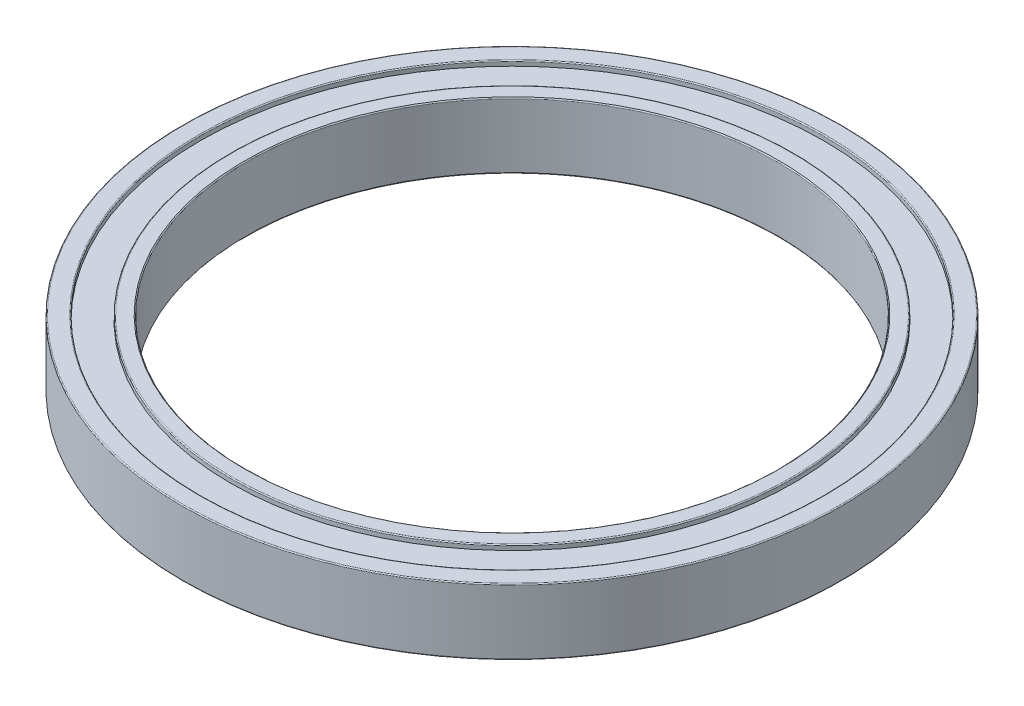
ISO-10303-21;
HEADER;
FILE_DESCRIPTION(('STEP AP214'),'2;1');
FILE_NAME('part.step','',(''),(''),'','','');
FILE_SCHEMA(('AUTOMOTIVE_DESIGN { 1 0 10303 214 1 1 1 1 }'));
ENDSEC;
DATA;
#1=APPLICATION_CONTEXT('core data for automotive mechanical design processes');
#2=APPLICATION_PROTOCOL_DEFINITION('international standard','automotive_design',2000,#1);
#3=PRODUCT_CONTEXT('',#1,'mechanical');
#4=PRODUCT('Part','Part','',(#3));
#5=PRODUCT_RELATED_PRODUCT_CATEGORY('part','',(#4));
#6=PRODUCT_DEFINITION_FORMATION('','',#4);
#7=PRODUCT_DEFINITION_CONTEXT('part definition',#1,'design');
#8=PRODUCT_DEFINITION('design','',#6,#7);
#9=PRODUCT_DEFINITION_SHAPE('','',#8);
#10=(LENGTH_UNIT() NAMED_UNIT(*) SI_UNIT(.MILLI.,.METRE.));
#11=(NAMED_UNIT(*) PLANE_ANGLE_UNIT() SI_UNIT($,.RADIAN.));
#12=(NAMED_UNIT(*) SI_UNIT($,.STERADIAN.) SOLID_ANGLE_UNIT());
#13=UNCERTAINTY_MEASURE_WITH_UNIT(LENGTH_MEASURE(1.E-05),#10,'distance_accuracy_value','');
#14=(GEOMETRIC_REPRESENTATION_CONTEXT(3) GLOBAL_UNCERTAINTY_ASSIGNED_CONTEXT((#13)) GLOBAL_UNIT_ASSIGNED_CONTEXT((#10,
#11,#12)) REPRESENTATION_CONTEXT('',''));
#15=CARTESIAN_POINT('',(0.,0.,0.));
#16=DIRECTION('',(0.,0.,1.));
#17=DIRECTION('',(1.,0.,0.));
#18=AXIS2_PLACEMENT_3D('',#15,#16,#17);
#19=CARTESIAN_POINT('',(0.,0.,0.));
#20=DIRECTION('',(0.,1.,0.));
#21=DIRECTION('',(0.,0.,1.));
#22=AXIS2_PLACEMENT_3D('',#19,#20,#21);
#23=PLANE('',#22);
#24=CARTESIAN_POINT('',(0.,0.,0.));
#25=DIRECTION('',(0.,1.,0.));
#26=DIRECTION('',(0.,0.,1.));
#27=AXIS2_PLACEMENT_3D('',#24,#25,#26);
#28=CIRCLE('',#27,52.7);
#29=CARTESIAN_POINT('',(0.,0.,52.7));
#30=VERTEX_POINT('',#29);
#31=EDGE_CURVE('E48',#30,#30,#28,.T.);
#32=ORIENTED_EDGE('',*,*,#31,.T.);
#33=EDGE_LOOP('',(#32));
#34=FACE_BOUND('',#33,.T.);
#35=CARTESIAN_POINT('',(0.,0.,0.));
#36=DIRECTION('',(0.,1.,0.));
#37=DIRECTION('',(0.,0.,1.));
#38=AXIS2_PLACEMENT_3D('',#35,#36,#37);
#39=CIRCLE('',#38,55.3);
#40=CARTESIAN_POINT('',(0.,0.,55.3));
#41=VERTEX_POINT('',#40);
#42=EDGE_CURVE('E52',#41,#41,#39,.F.);
#43=ORIENTED_EDGE('',*,*,#42,.T.);
#44=EDGE_LOOP('',(#43));
#45=FACE_BOUND('',#44,.T.);
#46=ADVANCED_FACE('F37',(#34,#45),#23,.F.);
#47=CARTESIAN_POINT('',(0.,13.,0.));
#48=DIRECTION('',(0.,1.,0.));
#49=DIRECTION('',(0.,0.,1.));
#50=AXIS2_PLACEMENT_3D('',#47,#48,#49);
#51=PLANE('',#50);
#52=CARTESIAN_POINT('',(0.,13.,0.));
#53=DIRECTION('',(0.,1.,0.));
#54=DIRECTION('',(0.,0.,1.));
#55=AXIS2_PLACEMENT_3D('',#52,#53,#54);
#56=CIRCLE('',#55,52.7);
#57=CARTESIAN_POINT('',(0.,13.,52.7));
#58=VERTEX_POINT('',#57);
#59=EDGE_CURVE('E84',#58,#58,#56,.F.);
#60=ORIENTED_EDGE('',*,*,#59,.T.);
#61=EDGE_LOOP('',(#60));
#62=FACE_BOUND('',#61,.T.);
#63=CARTESIAN_POINT('',(0.,13.,0.));
#64=DIRECTION('',(0.,1.,0.));
#65=DIRECTION('',(0.,0.,1.));
#66=AXIS2_PLACEMENT_3D('',#63,#64,#65);
#67=CIRCLE('',#66,55.3);
#68=CARTESIAN_POINT('',(0.,13.,55.3));
#69=VERTEX_POINT('',#68);
#70=EDGE_CURVE('E87',#69,#69,#67,.T.);
#71=ORIENTED_EDGE('',*,*,#70,.T.);
#72=EDGE_LOOP('',(#71));
#73=FACE_BOUND('',#72,.T.);
#74=ADVANCED_FACE('F124',(#62,#73),#51,.T.);
#75=CARTESIAN_POINT('',(0.,13.,0.));
#76=DIRECTION('',(0.,1.,0.));
#77=DIRECTION('',(0.,0.,1.));
#78=AXIS2_PLACEMENT_3D('',#75,#76,#77);
#79=CIRCLE('',#78,61.7);
#80=CARTESIAN_POINT('',(0.,13.,61.7));
#81=VERTEX_POINT('',#80);
#82=EDGE_CURVE('E72',#81,#81,#79,.F.);
#83=ORIENTED_EDGE('',*,*,#82,.T.);
#84=EDGE_LOOP('',(#83));
#85=FACE_BOUND('',#84,.T.);
#86=CARTESIAN_POINT('',(0.,13.,0.));
#87=DIRECTION('',(0.,1.,0.));
#88=DIRECTION('',(0.,0.,1.));
#89=AXIS2_PLACEMENT_3D('',#86,#87,#88);
#90=CIRCLE('',#89,64.8);
#91=CARTESIAN_POINT('',(0.,13.,64.8));
#92=VERTEX_POINT('',#91);
#93=EDGE_CURVE('E75',#92,#92,#90,.T.);
#94=ORIENTED_EDGE('',*,*,#93,.T.);
#95=EDGE_LOOP('',(#94));
#96=FACE_BOUND('',#95,.T.);
#97=ADVANCED_FACE('F131',(#85,#96),#51,.T.);
#98=CARTESIAN_POINT('',(0.,0.,0.));
#99=DIRECTION('',(0.,1.,0.));
#100=DIRECTION('',(0.,0.,1.));
#101=AXIS2_PLACEMENT_3D('',#98,#99,#100);
#102=CIRCLE('',#101,61.7);
#103=CARTESIAN_POINT('',(0.,0.,61.7));
#104=VERTEX_POINT('',#103);
#105=EDGE_CURVE('E63',#104,#104,#102,.T.);
#106=ORIENTED_EDGE('',*,*,#105,.T.);
#107=EDGE_LOOP('',(#106));
#108=FACE_BOUND('',#107,.T.);
#109=CARTESIAN_POINT('',(0.,0.,0.));
#110=DIRECTION('',(0.,1.,0.));
#111=DIRECTION('',(0.,0.,1.));
#112=AXIS2_PLACEMENT_3D('',#109,#110,#111);
#113=CIRCLE('',#112,64.8);
#114=CARTESIAN_POINT('',(0.,0.,64.8));
#115=VERTEX_POINT('',#114);
#116=EDGE_CURVE('E66',#115,#115,#113,.F.);
#117=ORIENTED_EDGE('',*,*,#116,.T.);
#118=EDGE_LOOP('',(#117));
#119=FACE_BOUND('',#118,.T.);
#120=ADVANCED_FACE('F127',(#108,#119),#23,.F.);
#121=CARTESIAN_POINT('',(0.,13.,0.));
#122=DIRECTION('',(0.,-1.,0.));
#123=DIRECTION('',(0.,0.,-1.));
#124=AXIS2_PLACEMENT_3D('',#121,#122,#123);
#125=CYLINDRICAL_SURFACE('',#124,65.);
#126=CARTESIAN_POINT('',(0.,0.200000000000001,0.));
#127=DIRECTION('',(0.,1.,0.));
#128=DIRECTION('',(0.,0.,1.));
#129=AXIS2_PLACEMENT_3D('',#126,#127,#128);
#130=CIRCLE('',#129,65.);
#131=CARTESIAN_POINT('',(0.,0.199999999999999,-65.));
#132=VERTEX_POINT('',#131);
#133=EDGE_CURVE('E57',#132,#132,#130,.T.);
#134=CARTESIAN_POINT('',(0.,12.8,0.));
#135=DIRECTION('',(0.,1.,0.));
#136=DIRECTION('',(0.,0.,1.));
#137=AXIS2_PLACEMENT_3D('',#134,#135,#136);
#138=CIRCLE('',#137,65.);
#139=CARTESIAN_POINT('',(0.,12.8,-65.));
#140=VERTEX_POINT('',#139);
#141=EDGE_CURVE('E69',#140,#140,#138,.F.);
#142=CARTESIAN_POINT('',(0.,0.199999999999999,-65.));
#143=CARTESIAN_POINT('',(0.,0.331249999999999,-65.));
#144=CARTESIAN_POINT('',(0.,0.462499999999999,-65.));
#145=CARTESIAN_POINT('',(0.,0.724999999999999,-65.));
#146=CARTESIAN_POINT('',(0.,0.856249999999999,-65.));
#147=CARTESIAN_POINT('',(0.,1.11875,-65.));
#148=CARTESIAN_POINT('',(0.,1.25,-65.));
#149=CARTESIAN_POINT('',(0.,1.5125,-65.));
#150=CARTESIAN_POINT('',(0.,1.64375,-65.));
#151=CARTESIAN_POINT('',(0.,1.90625,-65.));
#152=CARTESIAN_POINT('',(0.,2.0375,-65.));
#153=CARTESIAN_POINT('',(0.,2.3,-65.));
#154=CARTESIAN_POINT('',(0.,2.43125,-65.));
#155=CARTESIAN_POINT('',(0.,2.69375,-65.));
#156=CARTESIAN_POINT('',(0.,2.825,-65.));
#157=CARTESIAN_POINT('',(0.,3.0875,-65.));
#158=CARTESIAN_POINT('',(0.,3.21875,-65.));
#159=CARTESIAN_POINT('',(0.,3.48125,-65.));
#160=CARTESIAN_POINT('',(0.,3.6125,-65.));
#161=CARTESIAN_POINT('',(0.,3.875,-65.));
#162=CARTESIAN_POINT('',(0.,4.00625,-65.));
#163=CARTESIAN_POINT('',(0.,4.26875,-65.));
#164=CARTESIAN_POINT('',(0.,4.4,-65.));
#165=CARTESIAN_POINT('',(0.,4.6625,-65.));
#166=CARTESIAN_POINT('',(0.,4.79375,-65.));
#167=CARTESIAN_POINT('',(0.,5.05625,-65.));
#168=CARTESIAN_POINT('',(0.,5.1875,-65.));
#169=CARTESIAN_POINT('',(0.,5.45,-65.));
#170=CARTESIAN_POINT('',(0.,5.58125,-65.));
#171=CARTESIAN_POINT('',(0.,5.84375,-65.));
#172=CARTESIAN_POINT('',(0.,5.975,-65.));
#173=CARTESIAN_POINT('',(0.,6.2375,-65.));
#174=CARTESIAN_POINT('',(0.,6.36875,-65.));
#175=CARTESIAN_POINT('',(0.,6.63125,-65.));
#176=CARTESIAN_POINT('',(0.,6.7625,-65.));
#177=CARTESIAN_POINT('',(0.,7.025,-65.));
#178=CARTESIAN_POINT('',(0.,7.15625,-65.));
#179=CARTESIAN_POINT('',(0.,7.41875,-65.));
#180=CARTESIAN_POINT('',(0.,7.55,-65.));
#181=CARTESIAN_POINT('',(0.,7.8125,-65.));
#182=CARTESIAN_POINT('',(0.,7.94375,-65.));
#183=CARTESIAN_POINT('',(0.,8.20625,-65.));
#184=CARTESIAN_POINT('',(0.,8.3375,-65.));
#185=CARTESIAN_POINT('',(0.,8.6,-65.));
#186=CARTESIAN_POINT('',(0.,8.73125,-65.));
#187=CARTESIAN_POINT('',(0.,8.99375,-65.));
#188=CARTESIAN_POINT('',(0.,9.125,-65.));
#189=CARTESIAN_POINT('',(0.,9.3875,-65.));
#190=CARTESIAN_POINT('',(0.,9.51875,-65.));
#191=CARTESIAN_POINT('',(0.,9.78125,-65.));
#192=CARTESIAN_POINT('',(0.,9.9125,-65.));
#193=CARTESIAN_POINT('',(0.,10.175,-65.));
#194=CARTESIAN_POINT('',(0.,10.30625,-65.));
#195=CARTESIAN_POINT('',(0.,10.56875,-65.));
#196=CARTESIAN_POINT('',(0.,10.7,-65.));
#197=CARTESIAN_POINT('',(0.,10.9625,-65.));
#198=CARTESIAN_POINT('',(0.,11.09375,-65.));
#199=CARTESIAN_POINT('',(0.,11.35625,-65.));
#200=CARTESIAN_POINT('',(0.,11.4875,-65.));
#201=CARTESIAN_POINT('',(0.,11.75,-65.));
#202=CARTESIAN_POINT('',(0.,11.88125,-65.));
#203=CARTESIAN_POINT('',(0.,12.14375,-65.));
#204=CARTESIAN_POINT('',(0.,12.275,-65.));
#205=CARTESIAN_POINT('',(0.,12.5375,-65.));
#206=CARTESIAN_POINT('',(0.,12.66875,-65.));
#207=CARTESIAN_POINT('',(0.,12.8,-65.));
#208=B_SPLINE_CURVE_WITH_KNOTS('',3,(#142,#143,#144,#145,#146,#147,#148,#149,#150,#151,#152,
#153,#154,#155,#156,#157,#158,#159,#160,#161,#162,#163,#164,#165,#166,#167,#168,#169,#170,#171,
#172,#173,#174,#175,#176,#177,#178,#179,#180,#181,#182,#183,#184,#185,#186,#187,#188,#189,#190,
#191,#192,#193,#194,#195,#196,#197,#198,#199,#200,#201,#202,#203,#204,#205,#206,#207),
.UNSPECIFIED.,.F.,.F.,(4,2,2,2,2,2,2,2,2,2,2,2,2,2,2,2,2,2,2,2,2,2,2,2,2,2,2,2,2,2,2,2,4),(0.,
0.39375,0.7875,1.18125,1.575,1.96875,2.3625,2.75625,3.15,3.54375,3.9375,4.33125,4.725,5.11875,
5.5125,5.90625,6.3,6.69375,7.0875,7.48125,7.875,8.26875,8.6625,9.05625,9.45,9.84375,10.2375,
10.63125,11.025,11.41875,11.8125,12.20625,12.6),.UNSPECIFIED.);
#209=EDGE_CURVE('BSEAM137',#132,#140,#208,.T.);
#210=ORIENTED_EDGE('',*,*,#133,.T.);
#211=ORIENTED_EDGE('',*,*,#141,.T.);
#212=ORIENTED_EDGE('',*,*,#209,.T.);
#213=ORIENTED_EDGE('',*,*,#209,.F.);
#214=EDGE_LOOP('',(#210,#212,#211,#213));
#215=FACE_BOUND('',#214,.T.);
#216=ADVANCED_FACE('F137',(#215),#125,.T.);
#217=CARTESIAN_POINT('',(0.,13.,0.));
#218=DIRECTION('',(0.,-1.,0.));
#219=DIRECTION('',(0.,0.,-1.));
#220=AXIS2_PLACEMENT_3D('',#217,#218,#219);
#221=CYLINDRICAL_SURFACE('',#220,52.5);
#222=CARTESIAN_POINT('',(0.,0.200000000000001,0.));
#223=DIRECTION('',(0.,1.,0.));
#224=DIRECTION('',(0.,0.,1.));
#225=AXIS2_PLACEMENT_3D('',#222,#223,#224);
#226=CIRCLE('',#225,52.5);
#227=CARTESIAN_POINT('',(0.,0.199999999999999,-52.5));
#228=VERTEX_POINT('',#227);
#229=EDGE_CURVE('E44',#228,#228,#226,.F.);
#230=CARTESIAN_POINT('',(0.,12.8,0.));
#231=DIRECTION('',(0.,1.,0.));
#232=DIRECTION('',(0.,0.,1.));
#233=AXIS2_PLACEMENT_3D('',#230,#231,#232);
#234=CIRCLE('',#233,52.5);
#235=CARTESIAN_POINT('',(0.,12.8,-52.5));
#236=VERTEX_POINT('',#235);
#237=EDGE_CURVE('E90',#236,#236,#234,.T.);
#238=CARTESIAN_POINT('',(0.,0.199999999999999,-52.5));
#239=CARTESIAN_POINT('',(0.,0.331249999999999,-52.5));
#240=CARTESIAN_POINT('',(0.,0.462499999999999,-52.5));
#241=CARTESIAN_POINT('',(0.,0.724999999999999,-52.5));
#242=CARTESIAN_POINT('',(0.,0.856249999999999,-52.5));
#243=CARTESIAN_POINT('',(0.,1.11875,-52.5));
#244=CARTESIAN_POINT('',(0.,1.25,-52.5));
#245=CARTESIAN_POINT('',(0.,1.5125,-52.5));
#246=CARTESIAN_POINT('',(0.,1.64375,-52.5));
#247=CARTESIAN_POINT('',(0.,1.90625,-52.5));
#248=CARTESIAN_POINT('',(0.,2.0375,-52.5));
#249=CARTESIAN_POINT('',(0.,2.3,-52.5));
#250=CARTESIAN_POINT('',(0.,2.43125,-52.5));
#251=CARTESIAN_POINT('',(0.,2.69375,-52.5));
#252=CARTESIAN_POINT('',(0.,2.825,-52.5));
#253=CARTESIAN_POINT('',(0.,3.0875,-52.5));
#254=CARTESIAN_POINT('',(0.,3.21875,-52.5));
#255=CARTESIAN_POINT('',(0.,3.48125,-52.5));
#256=CARTESIAN_POINT('',(0.,3.6125,-52.5));
#257=CARTESIAN_POINT('',(0.,3.875,-52.5));
#258=CARTESIAN_POINT('',(0.,4.00625,-52.5));
#259=CARTESIAN_POINT('',(0.,4.26875,-52.5));
#260=CARTESIAN_POINT('',(0.,4.4,-52.5));
#261=CARTESIAN_POINT('',(0.,4.6625,-52.5));
#262=CARTESIAN_POINT('',(0.,4.79375,-52.5));
#263=CARTESIAN_POINT('',(0.,5.05625,-52.5));
#264=CARTESIAN_POINT('',(0.,5.1875,-52.5));
#265=CARTESIAN_POINT('',(0.,5.45,-52.5));
#266=CARTESIAN_POINT('',(0.,5.58125,-52.5));
#267=CARTESIAN_POINT('',(0.,5.84375,-52.5));
#268=CARTESIAN_POINT('',(0.,5.975,-52.5));
#269=CARTESIAN_POINT('',(0.,6.2375,-52.5));
#270=CARTESIAN_POINT('',(0.,6.36875,-52.5));
#271=CARTESIAN_POINT('',(0.,6.63125,-52.5));
#272=CARTESIAN_POINT('',(0.,6.7625,-52.5));
#273=CARTESIAN_POINT('',(0.,7.025,-52.5));
#274=CARTESIAN_POINT('',(0.,7.15625,-52.5));
#275=CARTESIAN_POINT('',(0.,7.41875,-52.5));
#276=CARTESIAN_POINT('',(0.,7.55,-52.5));
#277=CARTESIAN_POINT('',(0.,7.8125,-52.5));
#278=CARTESIAN_POINT('',(0.,7.94375,-52.5));
#279=CARTESIAN_POINT('',(0.,8.20625,-52.5));
#280=CARTESIAN_POINT('',(0.,8.3375,-52.5));
#281=CARTESIAN_POINT('',(0.,8.6,-52.5));
#282=CARTESIAN_POINT('',(0.,8.73125,-52.5));
#283=CARTESIAN_POINT('',(0.,8.99375,-52.5));
#284=CARTESIAN_POINT('',(0.,9.125,-52.5));
#285=CARTESIAN_POINT('',(0.,9.3875,-52.5));
#286=CARTESIAN_POINT('',(0.,9.51875,-52.5));
#287=CARTESIAN_POINT('',(0.,9.78125,-52.5));
#288=CARTESIAN_POINT('',(0.,9.9125,-52.5));
#289=CARTESIAN_POINT('',(0.,10.175,-52.5));
#290=CARTESIAN_POINT('',(0.,10.30625,-52.5));
#291=CARTESIAN_POINT('',(0.,10.56875,-52.5));
#292=CARTESIAN_POINT('',(0.,10.7,-52.5));
#293=CARTESIAN_POINT('',(0.,10.9625,-52.5));
#294=CARTESIAN_POINT('',(0.,11.09375,-52.5));
#295=CARTESIAN_POINT('',(0.,11.35625,-52.5));
#296=CARTESIAN_POINT('',(0.,11.4875,-52.5));
#297=CARTESIAN_POINT('',(0.,11.75,-52.5));
#298=CARTESIAN_POINT('',(0.,11.88125,-52.5));
#299=CARTESIAN_POINT('',(0.,12.14375,-52.5));
#300=CARTESIAN_POINT('',(0.,12.275,-52.5));
#301=CARTESIAN_POINT('',(0.,12.5375,-52.5));
#302=CARTESIAN_POINT('',(0.,12.66875,-52.5));
#303=CARTESIAN_POINT('',(0.,12.8,-52.5));
#304=B_SPLINE_CURVE_WITH_KNOTS('',3,(#238,#239,#240,#241,#242,#243,#244,#245,#246,#247,#248,
#249,#250,#251,#252,#253,#254,#255,#256,#257,#258,#259,#260,#261,#262,#263,#264,#265,#266,#267,
#268,#269,#270,#271,#272,#273,#274,#275,#276,#277,#278,#279,#280,#281,#282,#283,#284,#285,#286,
#287,#288,#289,#290,#291,#292,#293,#294,#295,#296,#297,#298,#299,#300,#301,#302,#303),
.UNSPECIFIED.,.F.,.F.,(4,2,2,2,2,2,2,2,2,2,2,2,2,2,2,2,2,2,2,2,2,2,2,2,2,2,2,2,2,2,2,2,4),(0.,
0.39375,0.7875,1.18125,1.575,1.96875,2.3625,2.75625,3.15,3.54375,3.9375,4.33125,4.725,5.11875,
5.5125,5.90625,6.3,6.69375,7.0875,7.48125,7.875,8.26875,8.6625,9.05625,9.45,9.84375,10.2375,
10.63125,11.025,11.41875,11.8125,12.20625,12.6),.UNSPECIFIED.);
#305=EDGE_CURVE('BSEAM143',#228,#236,#304,.T.);
#306=ORIENTED_EDGE('',*,*,#229,.T.);
#307=ORIENTED_EDGE('',*,*,#237,.T.);
#308=ORIENTED_EDGE('',*,*,#305,.T.);
#309=ORIENTED_EDGE('',*,*,#305,.F.);
#310=EDGE_LOOP('',(#306,#308,#307,#309));
#311=FACE_BOUND('',#310,.T.);
#312=ADVANCED_FACE('F143',(#311),#221,.F.);
#313=CARTESIAN_POINT('',(0.,12.,0.));
#314=DIRECTION('',(0.,1.,0.));
#315=DIRECTION('',(0.,0.,1.));
#316=AXIS2_PLACEMENT_3D('',#313,#314,#315);
#317=CYLINDRICAL_SURFACE('',#316,61.5);
#318=CARTESIAN_POINT('',(0.,12.8,0.));
#319=DIRECTION('',(0.,1.,0.));
#320=DIRECTION('',(0.,0.,1.));
#321=AXIS2_PLACEMENT_3D('',#318,#319,#320);
#322=CIRCLE('',#321,61.5);
#323=CARTESIAN_POINT('',(0.,12.8,61.5));
#324=VERTEX_POINT('',#323);
#325=EDGE_CURVE('E78',#324,#324,#322,.T.);
#326=ORIENTED_EDGE('',*,*,#325,.T.);
#327=EDGE_LOOP('',(#326));
#328=FACE_BOUND('',#327,.T.);
#329=CARTESIAN_POINT('',(0.,12.,0.));
#330=DIRECTION('',(0.,1.,0.));
#331=DIRECTION('',(0.,0.,1.));
#332=AXIS2_PLACEMENT_3D('',#329,#330,#331);
#333=CIRCLE('',#332,61.5);
#334=CARTESIAN_POINT('',(0.,12.,61.5));
#335=VERTEX_POINT('',#334);
#336=EDGE_CURVE('E93',#335,#335,#333,.T.);
#337=ORIENTED_EDGE('',*,*,#336,.F.);
#338=EDGE_LOOP('',(#337));
#339=FACE_BOUND('',#338,.T.);
#340=ADVANCED_FACE('F222',(#328,#339),#317,.F.);
#341=CARTESIAN_POINT('',(0.,12.,0.));
#342=DIRECTION('',(0.,1.,0.));
#343=DIRECTION('',(0.,0.,1.));
#344=AXIS2_PLACEMENT_3D('',#341,#342,#343);
#345=PLANE('',#344);
#346=CARTESIAN_POINT('',(0.,12.,0.));
#347=DIRECTION('',(0.,1.,0.));
#348=DIRECTION('',(0.,0.,1.));
#349=AXIS2_PLACEMENT_3D('',#346,#347,#348);
#350=CIRCLE('',#349,55.5);
#351=CARTESIAN_POINT('',(0.,12.,55.5));
#352=VERTEX_POINT('',#351);
#353=EDGE_CURVE('E96',#352,#352,#350,.T.);
#354=ORIENTED_EDGE('',*,*,#353,.F.);
#355=EDGE_LOOP('',(#354));
#356=FACE_BOUND('',#355,.T.);
#357=ORIENTED_EDGE('',*,*,#336,.T.);
#358=EDGE_LOOP('',(#357));
#359=FACE_BOUND('',#358,.T.);
#360=ADVANCED_FACE('F282',(#356,#359),#345,.T.);
#361=CARTESIAN_POINT('',(0.,12.,0.));
#362=DIRECTION('',(0.,1.,0.));
#363=DIRECTION('',(0.,0.,1.));
#364=AXIS2_PLACEMENT_3D('',#361,#362,#363);
#365=CYLINDRICAL_SURFACE('',#364,55.5);
#366=CARTESIAN_POINT('',(0.,12.8,0.));
#367=DIRECTION('',(0.,1.,0.));
#368=DIRECTION('',(0.,0.,1.));
#369=AXIS2_PLACEMENT_3D('',#366,#367,#368);
#370=CIRCLE('',#369,55.5);
#371=CARTESIAN_POINT('',(0.,12.8,55.5));
#372=VERTEX_POINT('',#371);
#373=EDGE_CURVE('E81',#372,#372,#370,.F.);
#374=ORIENTED_EDGE('',*,*,#373,.T.);
#375=EDGE_LOOP('',(#374));
#376=FACE_BOUND('',#375,.T.);
#377=ORIENTED_EDGE('',*,*,#353,.T.);
#378=EDGE_LOOP('',(#377));
#379=FACE_BOUND('',#378,.T.);
#380=ADVANCED_FACE('F272',(#376,#379),#365,.T.);
#381=CARTESIAN_POINT('',(0.,12.8,0.));
#382=DIRECTION('',(0.,1.,0.));
#383=DIRECTION('',(0.,0.,1.));
#384=AXIS2_PLACEMENT_3D('',#381,#382,#383);
#385=TOROIDAL_SURFACE('',#384,52.7,0.2);
#386=ORIENTED_EDGE('',*,*,#59,.F.);
#387=EDGE_LOOP('',(#386));
#388=FACE_BOUND('',#387,.T.);
#389=ORIENTED_EDGE('',*,*,#237,.F.);
#390=EDGE_LOOP('',(#389));
#391=FACE_BOUND('',#390,.T.);
#392=ADVANCED_FACE('F263',(#388,#391),#385,.T.);
#393=CARTESIAN_POINT('',(0.,12.8,0.));
#394=DIRECTION('',(0.,1.,0.));
#395=DIRECTION('',(0.,0.,1.));
#396=AXIS2_PLACEMENT_3D('',#393,#394,#395);
#397=TOROIDAL_SURFACE('',#396,55.3,0.2);
#398=ORIENTED_EDGE('',*,*,#373,.F.);
#399=EDGE_LOOP('',(#398));
#400=FACE_BOUND('',#399,.T.);
#401=ORIENTED_EDGE('',*,*,#70,.F.);
#402=EDGE_LOOP('',(#401));
#403=FACE_BOUND('',#402,.T.);
#404=ADVANCED_FACE('F170',(#400,#403),#397,.T.);
#405=CARTESIAN_POINT('',(0.,12.8,0.));
#406=DIRECTION('',(0.,1.,0.));
#407=DIRECTION('',(0.,0.,1.));
#408=AXIS2_PLACEMENT_3D('',#405,#406,#407);
#409=TOROIDAL_SURFACE('',#408,61.7,0.2);
#410=ORIENTED_EDGE('',*,*,#82,.F.);
#411=EDGE_LOOP('',(#410));
#412=FACE_BOUND('',#411,.T.);
#413=ORIENTED_EDGE('',*,*,#325,.F.);
#414=EDGE_LOOP('',(#413));
#415=FACE_BOUND('',#414,.T.);
#416=ADVANCED_FACE('F161',(#412,#415),#409,.T.);
#417=CARTESIAN_POINT('',(0.,12.8,0.));
#418=DIRECTION('',(0.,1.,0.));
#419=DIRECTION('',(0.,0.,1.));
#420=AXIS2_PLACEMENT_3D('',#417,#418,#419);
#421=TOROIDAL_SURFACE('',#420,64.8,0.2);
#422=ORIENTED_EDGE('',*,*,#141,.F.);
#423=EDGE_LOOP('',(#422));
#424=FACE_BOUND('',#423,.T.);
#425=ORIENTED_EDGE('',*,*,#93,.F.);
#426=EDGE_LOOP('',(#425));
#427=FACE_BOUND('',#426,.T.);
#428=ADVANCED_FACE('F158',(#424,#427),#421,.T.);
#429=CARTESIAN_POINT('',(0.,1.,0.));
#430=DIRECTION('',(0.,-1.,0.));
#431=DIRECTION('',(0.,0.,1.));
#432=AXIS2_PLACEMENT_3D('',#429,#430,#431);
#433=PLANE('',#432);
#434=CARTESIAN_POINT('',(0.,1.,0.));
#435=DIRECTION('',(0.,1.,0.));
#436=DIRECTION('',(0.,0.,1.));
#437=AXIS2_PLACEMENT_3D('',#434,#435,#436);
#438=CIRCLE('',#437,61.5);
#439=CARTESIAN_POINT('',(0.,1.,61.5));
#440=VERTEX_POINT('',#439);
#441=EDGE_CURVE('E99',#440,#440,#438,.T.);
#442=ORIENTED_EDGE('',*,*,#441,.F.);
#443=EDGE_LOOP('',(#442));
#444=FACE_BOUND('',#443,.T.);
#445=CARTESIAN_POINT('',(0.,1.,0.));
#446=DIRECTION('',(0.,1.,0.));
#447=DIRECTION('',(0.,0.,1.));
#448=AXIS2_PLACEMENT_3D('',#445,#446,#447);
#449=CIRCLE('',#448,55.5);
#450=CARTESIAN_POINT('',(0.,1.,55.5));
#451=VERTEX_POINT('',#450);
#452=EDGE_CURVE('E102',#451,#451,#449,.T.);
#453=ORIENTED_EDGE('',*,*,#452,.T.);
#454=EDGE_LOOP('',(#453));
#455=FACE_BOUND('',#454,.T.);
#456=ADVANCED_FACE('F106',(#444,#455),#433,.T.);
#457=CARTESIAN_POINT('',(0.,1.,0.));
#458=DIRECTION('',(0.,-1.,0.));
#459=DIRECTION('',(0.,0.,-1.));
#460=AXIS2_PLACEMENT_3D('',#457,#458,#459);
#461=CYLINDRICAL_SURFACE('',#460,61.5);
#462=CARTESIAN_POINT('',(0.,0.2,0.));
#463=DIRECTION('',(0.,1.,0.));
#464=DIRECTION('',(0.,0.,1.));
#465=AXIS2_PLACEMENT_3D('',#462,#463,#464);
#466=CIRCLE('',#465,61.5);
#467=CARTESIAN_POINT('',(0.,0.2,61.5));
#468=VERTEX_POINT('',#467);
#469=EDGE_CURVE('E60',#468,#468,#466,.F.);
#470=ORIENTED_EDGE('',*,*,#469,.T.);
#471=EDGE_LOOP('',(#470));
#472=FACE_BOUND('',#471,.T.);
#473=ORIENTED_EDGE('',*,*,#441,.T.);
#474=EDGE_LOOP('',(#473));
#475=FACE_BOUND('',#474,.T.);
#476=ADVANCED_FACE('F111',(#472,#475),#461,.F.);
#477=CARTESIAN_POINT('',(0.,1.,0.));
#478=DIRECTION('',(0.,-1.,0.));
#479=DIRECTION('',(0.,0.,-1.));
#480=AXIS2_PLACEMENT_3D('',#477,#478,#479);
#481=CYLINDRICAL_SURFACE('',#480,55.5);
#482=CARTESIAN_POINT('',(0.,0.2,0.));
#483=DIRECTION('',(0.,1.,0.));
#484=DIRECTION('',(0.,0.,1.));
#485=AXIS2_PLACEMENT_3D('',#482,#483,#484);
#486=CIRCLE('',#485,55.5);
#487=CARTESIAN_POINT('',(0.,0.2,55.5));
#488=VERTEX_POINT('',#487);
#489=EDGE_CURVE('E10',#488,#488,#486,.T.);
#490=ORIENTED_EDGE('',*,*,#489,.T.);
#491=EDGE_LOOP('',(#490));
#492=FACE_BOUND('',#491,.T.);
#493=ORIENTED_EDGE('',*,*,#452,.F.);
#494=EDGE_LOOP('',(#493));
#495=FACE_BOUND('',#494,.T.);
#496=ADVANCED_FACE('F108',(#492,#495),#481,.T.);
#497=CARTESIAN_POINT('',(0.,0.2,0.));
#498=DIRECTION('',(0.,1.,0.));
#499=DIRECTION('',(0.,0.,1.));
#500=AXIS2_PLACEMENT_3D('',#497,#498,#499);
#501=TOROIDAL_SURFACE('',#500,61.7,0.2);
#502=ORIENTED_EDGE('',*,*,#469,.F.);
#503=EDGE_LOOP('',(#502));
#504=FACE_BOUND('',#503,.T.);
#505=ORIENTED_EDGE('',*,*,#105,.F.);
#506=EDGE_LOOP('',(#505));
#507=FACE_BOUND('',#506,.T.);
#508=ADVANCED_FACE('F110',(#504,#507),#501,.T.);
#509=CARTESIAN_POINT('',(0.,0.200000000000001,0.));
#510=DIRECTION('',(0.,1.,0.));
#511=DIRECTION('',(0.,0.,1.));
#512=AXIS2_PLACEMENT_3D('',#509,#510,#511);
#513=TOROIDAL_SURFACE('',#512,64.8,0.2);
#514=ORIENTED_EDGE('',*,*,#116,.F.);
#515=EDGE_LOOP('',(#514));
#516=FACE_BOUND('',#515,.T.);
#517=ORIENTED_EDGE('',*,*,#133,.F.);
#518=EDGE_LOOP('',(#517));
#519=FACE_BOUND('',#518,.T.);
#520=ADVANCED_FACE('F117',(#516,#519),#513,.T.);
#521=CARTESIAN_POINT('',(0.,0.200000000000001,0.));
#522=DIRECTION('',(0.,1.,0.));
#523=DIRECTION('',(0.,0.,1.));
#524=AXIS2_PLACEMENT_3D('',#521,#522,#523);
#525=TOROIDAL_SURFACE('',#524,52.7,0.2);
#526=ORIENTED_EDGE('',*,*,#229,.F.);
#527=EDGE_LOOP('',(#526));
#528=FACE_BOUND('',#527,.T.);
#529=ORIENTED_EDGE('',*,*,#31,.F.);
#530=EDGE_LOOP('',(#529));
#531=FACE_BOUND('',#530,.T.);
#532=ADVANCED_FACE('F152',(#528,#531),#525,.T.);
#533=CARTESIAN_POINT('',(0.,0.2,0.));
#534=DIRECTION('',(0.,1.,0.));
#535=DIRECTION('',(0.,0.,1.));
#536=AXIS2_PLACEMENT_3D('',#533,#534,#535);
#537=TOROIDAL_SURFACE('',#536,55.3,0.2);
#538=ORIENTED_EDGE('',*,*,#42,.F.);
#539=EDGE_LOOP('',(#538));
#540=FACE_BOUND('',#539,.T.);
#541=ORIENTED_EDGE('',*,*,#489,.F.);
#542=EDGE_LOOP('',(#541));
#543=FACE_BOUND('',#542,.T.);
#544=ADVANCED_FACE('F39',(#540,#543),#537,.T.);
#545=CLOSED_SHELL('',(#46,#74,#97,#120,#216,#312,#340,#360,#380,#392,#404,#416,#428,#456,#476,
#496,#508,#520,#532,#544));
#546=MANIFOLD_SOLID_BREP('B2',#545);
#547=ADVANCED_BREP_SHAPE_REPRESENTATION('',(#18,#546),#14);
#548=SHAPE_DEFINITION_REPRESENTATION(#9,#547);
ENDSEC;
END-ISO-10303-21;
